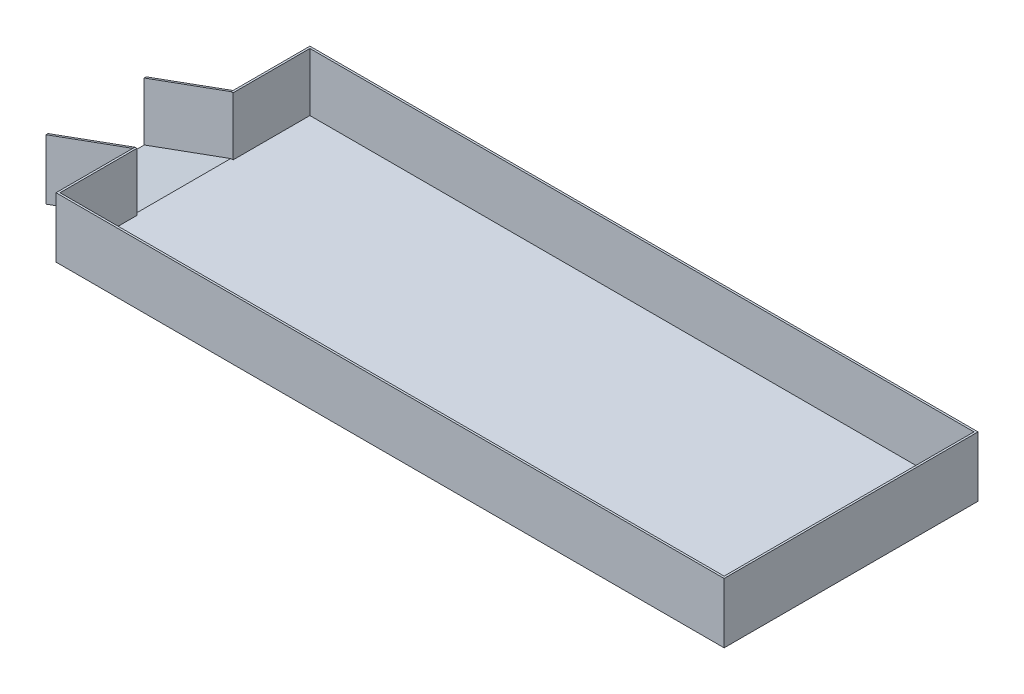
ISO-10303-21;
HEADER;
FILE_DESCRIPTION(('STEP AP214'),'2;1');
FILE_NAME('part.step','',(''),(''),'','','');
FILE_SCHEMA(('AUTOMOTIVE_DESIGN { 1 0 10303 214 1 1 1 1 }'));
ENDSEC;
DATA;
#1=APPLICATION_CONTEXT('core data for automotive mechanical design processes');
#2=APPLICATION_PROTOCOL_DEFINITION('international standard','automotive_design',2000,#1);
#3=PRODUCT_CONTEXT('',#1,'mechanical');
#4=PRODUCT('Part','Part','',(#3));
#5=PRODUCT_RELATED_PRODUCT_CATEGORY('part','',(#4));
#6=PRODUCT_DEFINITION_FORMATION('','',#4);
#7=PRODUCT_DEFINITION_CONTEXT('part definition',#1,'design');
#8=PRODUCT_DEFINITION('design','',#6,#7);
#9=PRODUCT_DEFINITION_SHAPE('','',#8);
#10=(LENGTH_UNIT() NAMED_UNIT(*) SI_UNIT(.MILLI.,.METRE.));
#11=(NAMED_UNIT(*) PLANE_ANGLE_UNIT() SI_UNIT($,.RADIAN.));
#12=(NAMED_UNIT(*) SI_UNIT($,.STERADIAN.) SOLID_ANGLE_UNIT());
#13=UNCERTAINTY_MEASURE_WITH_UNIT(LENGTH_MEASURE(1.E-05),#10,'distance_accuracy_value','');
#14=(GEOMETRIC_REPRESENTATION_CONTEXT(3) GLOBAL_UNCERTAINTY_ASSIGNED_CONTEXT((#13)) GLOBAL_UNIT_ASSIGNED_CONTEXT((#10,
#11,#12)) REPRESENTATION_CONTEXT('',''));
#15=CARTESIAN_POINT('',(0.,0.,0.));
#16=DIRECTION('',(0.,0.,1.));
#17=DIRECTION('',(1.,0.,0.));
#18=AXIS2_PLACEMENT_3D('',#15,#16,#17);
#19=CARTESIAN_POINT('',(0.,90.,0.));
#20=DIRECTION('',(0.,-1.,0.));
#21=DIRECTION('',(0.,0.,-1.));
#22=AXIS2_PLACEMENT_3D('',#19,#20,#21);
#23=PLANE('',#22);
#24=DIRECTION('',(-1.,0.,0.));
#25=VECTOR('',#24,1.);
#26=CARTESIAN_POINT('',(0.,90.,-72.));
#27=LINE('',#26,#25);
#28=CARTESIAN_POINT('',(-497.,90.,-72.));
#29=VERTEX_POINT('',#28);
#30=CARTESIAN_POINT('',(-500.,90.,-72.));
#31=VERTEX_POINT('',#30);
#32=EDGE_CURVE('E204',#29,#31,#27,.T.);
#33=ORIENTED_EDGE('',*,*,#32,.F.);
#34=DIRECTION('',(0.,0.,1.));
#35=VECTOR('',#34,1.);
#36=CARTESIAN_POINT('',(-497.,90.,0.));
#37=LINE('',#36,#35);
#38=CARTESIAN_POINT('',(-497.,90.,-187.));
#39=VERTEX_POINT('',#38);
#40=EDGE_CURVE('E206',#39,#29,#37,.T.);
#41=ORIENTED_EDGE('',*,*,#40,.F.);
#42=DIRECTION('',(-1.,0.,0.));
#43=VECTOR('',#42,1.);
#44=CARTESIAN_POINT('',(0.,90.,-187.));
#45=LINE('',#44,#43);
#46=CARTESIAN_POINT('',(497.,90.,-187.));
#47=VERTEX_POINT('',#46);
#48=EDGE_CURVE('E172',#47,#39,#45,.T.);
#49=ORIENTED_EDGE('',*,*,#48,.F.);
#50=DIRECTION('',(0.,0.,-1.));
#51=VECTOR('',#50,1.);
#52=CARTESIAN_POINT('',(497.,90.,0.));
#53=LINE('',#52,#51);
#54=CARTESIAN_POINT('',(497.,90.,187.));
#55=VERTEX_POINT('',#54);
#56=EDGE_CURVE('E168',#55,#47,#53,.T.);
#57=ORIENTED_EDGE('',*,*,#56,.F.);
#58=DIRECTION('',(1.,0.,0.));
#59=VECTOR('',#58,1.);
#60=CARTESIAN_POINT('',(0.,90.,187.));
#61=LINE('',#60,#59);
#62=CARTESIAN_POINT('',(-497.,90.,187.));
#63=VERTEX_POINT('',#62);
#64=EDGE_CURVE('E178',#63,#55,#61,.T.);
#65=ORIENTED_EDGE('',*,*,#64,.F.);
#66=DIRECTION('',(0.,0.,1.));
#67=VECTOR('',#66,1.);
#68=CARTESIAN_POINT('',(-497.,90.,0.));
#69=LINE('',#68,#67);
#70=CARTESIAN_POINT('',(-497.,90.,72.));
#71=VERTEX_POINT('',#70);
#72=EDGE_CURVE('E161',#71,#63,#69,.T.);
#73=ORIENTED_EDGE('',*,*,#72,.F.);
#74=DIRECTION('',(-1.,0.,0.));
#75=VECTOR('',#74,1.);
#76=CARTESIAN_POINT('',(0.,90.,72.));
#77=LINE('',#76,#75);
#78=CARTESIAN_POINT('',(-500.,90.,72.));
#79=VERTEX_POINT('',#78);
#80=EDGE_CURVE('E225',#71,#79,#77,.T.);
#81=ORIENTED_EDGE('',*,*,#80,.T.);
#82=DIRECTION('',(0.,0.,-1.));
#83=VECTOR('',#82,1.);
#84=CARTESIAN_POINT('',(-500.,90.,75.));
#85=LINE('',#84,#83);
#86=CARTESIAN_POINT('',(-500.,90.,75.));
#87=VERTEX_POINT('',#86);
#88=EDGE_CURVE('E253',#87,#79,#85,.T.);
#89=ORIENTED_EDGE('',*,*,#88,.F.);
#90=DIRECTION('',(0.,0.,1.));
#91=VECTOR('',#90,1.);
#92=CARTESIAN_POINT('',(-500.,90.,190.));
#93=LINE('',#92,#91);
#94=CARTESIAN_POINT('',(-500.,90.,190.));
#95=VERTEX_POINT('',#94);
#96=EDGE_CURVE('E263',#87,#95,#93,.T.);
#97=ORIENTED_EDGE('',*,*,#96,.T.);
#98=DIRECTION('',(1.,0.,0.));
#99=VECTOR('',#98,1.);
#100=CARTESIAN_POINT('',(-500.,90.,190.));
#101=LINE('',#100,#99);
#102=CARTESIAN_POINT('',(500.,90.,190.));
#103=VERTEX_POINT('',#102);
#104=EDGE_CURVE('E270',#95,#103,#101,.T.);
#105=ORIENTED_EDGE('',*,*,#104,.T.);
#106=DIRECTION('',(0.,0.,-1.));
#107=VECTOR('',#106,1.);
#108=CARTESIAN_POINT('',(500.,90.,190.));
#109=LINE('',#108,#107);
#110=CARTESIAN_POINT('',(500.,90.,-190.));
#111=VERTEX_POINT('',#110);
#112=EDGE_CURVE('E260',#103,#111,#109,.T.);
#113=ORIENTED_EDGE('',*,*,#112,.T.);
#114=DIRECTION('',(-1.,0.,0.));
#115=VECTOR('',#114,1.);
#116=CARTESIAN_POINT('',(-500.,90.,-190.));
#117=LINE('',#116,#115);
#118=CARTESIAN_POINT('',(-500.,90.,-190.));
#119=VERTEX_POINT('',#118);
#120=EDGE_CURVE('E257',#111,#119,#117,.T.);
#121=ORIENTED_EDGE('',*,*,#120,.T.);
#122=CARTESIAN_POINT('',(-500.,90.,-75.));
#123=VERTEX_POINT('',#122);
#124=EDGE_CURVE('E262',#119,#123,#93,.T.);
#125=ORIENTED_EDGE('',*,*,#124,.T.);
#126=EDGE_CURVE('E39',#31,#123,#85,.T.);
#127=ORIENTED_EDGE('',*,*,#126,.F.);
#128=EDGE_LOOP('',(#33,#41,#49,#57,#65,#73,#81,#89,#97,#105,#113,#121,#125,#127));
#129=FACE_BOUND('',#128,.T.);
#130=ADVANCED_FACE('F16',(#129),#23,.F.);
#131=CARTESIAN_POINT('',(-500.,90.,75.));
#132=DIRECTION('',(0.34202014332567,-0.939692620785908,0.));
#133=DIRECTION('',(0.939692620785908,0.34202014332567,0.));
#134=AXIS2_PLACEMENT_3D('',#131,#132,#133);
#135=PLANE('',#134);
#136=DIRECTION('',(-0.939692620785908,-0.34202014332567,0.));
#137=VECTOR('',#136,1.);
#138=CARTESIAN_POINT('',(-500.,90.,-72.));
#139=LINE('',#138,#137);
#140=CARTESIAN_POINT('',(-630.,42.6838695453934,-72.));
#141=VERTEX_POINT('',#140);
#142=EDGE_CURVE('E191',#31,#141,#139,.T.);
#143=ORIENTED_EDGE('',*,*,#142,.F.);
#144=ORIENTED_EDGE('',*,*,#126,.T.);
#145=DIRECTION('',(-0.939692620785908,-0.34202014332567,0.));
#146=VECTOR('',#145,1.);
#147=CARTESIAN_POINT('',(-500.,90.,-75.));
#148=LINE('',#147,#146);
#149=CARTESIAN_POINT('',(-630.,42.6838695453934,-75.));
#150=VERTEX_POINT('',#149);
#151=EDGE_CURVE('E245',#123,#150,#148,.T.);
#152=ORIENTED_EDGE('',*,*,#151,.T.);
#153=DIRECTION('',(0.,0.,-1.));
#154=VECTOR('',#153,1.);
#155=CARTESIAN_POINT('',(-630.,42.6838695453934,75.));
#156=LINE('',#155,#154);
#157=EDGE_CURVE('E250',#141,#150,#156,.T.);
#158=ORIENTED_EDGE('',*,*,#157,.F.);
#159=EDGE_LOOP('',(#143,#144,#152,#158));
#160=FACE_BOUND('',#159,.T.);
#161=ADVANCED_FACE('F332',(#160),#135,.F.);
#162=CARTESIAN_POINT('',(-630.,42.6838695453934,75.));
#163=DIRECTION('',(1.,0.,0.));
#164=DIRECTION('',(0.,0.,-1.));
#165=AXIS2_PLACEMENT_3D('',#162,#163,#164);
#166=PLANE('',#165);
#167=DIRECTION('',(0.,-1.,0.));
#168=VECTOR('',#167,1.);
#169=CARTESIAN_POINT('',(-630.,42.6838695453934,-72.));
#170=LINE('',#169,#168);
#171=CARTESIAN_POINT('',(-630.,-44.1235971371788,-72.));
#172=VERTEX_POINT('',#171);
#173=EDGE_CURVE('E199',#141,#172,#170,.T.);
#174=ORIENTED_EDGE('',*,*,#173,.F.);
#175=ORIENTED_EDGE('',*,*,#157,.T.);
#176=DIRECTION('',(0.,-1.,0.));
#177=VECTOR('',#176,1.);
#178=CARTESIAN_POINT('',(-630.,42.6838695453934,-75.));
#179=LINE('',#178,#177);
#180=CARTESIAN_POINT('',(-630.,-47.3161304546065,-75.));
#181=VERTEX_POINT('',#180);
#182=EDGE_CURVE('E230',#150,#181,#179,.T.);
#183=ORIENTED_EDGE('',*,*,#182,.T.);
#184=DIRECTION('',(0.,0.,-1.));
#185=VECTOR('',#184,1.);
#186=CARTESIAN_POINT('',(-630.,-47.3161304546065,75.));
#187=LINE('',#186,#185);
#188=CARTESIAN_POINT('',(-630.,-47.3161304546065,75.));
#189=VERTEX_POINT('',#188);
#190=EDGE_CURVE('E236',#189,#181,#187,.T.);
#191=ORIENTED_EDGE('',*,*,#190,.F.);
#192=DIRECTION('',(0.,-1.,0.));
#193=VECTOR('',#192,1.);
#194=CARTESIAN_POINT('',(-630.,42.6838695453934,75.));
#195=LINE('',#194,#193);
#196=CARTESIAN_POINT('',(-630.,42.6838695453934,75.));
#197=VERTEX_POINT('',#196);
#198=EDGE_CURVE('E234',#197,#189,#195,.T.);
#199=ORIENTED_EDGE('',*,*,#198,.F.);
#200=CARTESIAN_POINT('',(-630.,42.6838695453934,72.));
#201=VERTEX_POINT('',#200);
#202=EDGE_CURVE('E248',#197,#201,#156,.T.);
#203=ORIENTED_EDGE('',*,*,#202,.T.);
#204=DIRECTION('',(0.,-1.,0.));
#205=VECTOR('',#204,1.);
#206=CARTESIAN_POINT('',(-630.,42.6838695453934,72.));
#207=LINE('',#206,#205);
#208=CARTESIAN_POINT('',(-630.,-44.1235971371788,72.));
#209=VERTEX_POINT('',#208);
#210=EDGE_CURVE('E214',#201,#209,#207,.T.);
#211=ORIENTED_EDGE('',*,*,#210,.T.);
#212=DIRECTION('',(0.,0.,-1.));
#213=VECTOR('',#212,1.);
#214=CARTESIAN_POINT('',(-630.,-44.1235971371788,75.));
#215=LINE('',#214,#213);
#216=EDGE_CURVE('E194',#209,#172,#215,.T.);
#217=ORIENTED_EDGE('',*,*,#216,.T.);
#218=EDGE_LOOP('',(#174,#175,#183,#191,#199,#203,#211,#217));
#219=FACE_BOUND('',#218,.T.);
#220=ADVANCED_FACE('F328',(#219),#166,.F.);
#221=CARTESIAN_POINT('',(-500.,90.,190.));
#222=DIRECTION('',(1.,0.,0.));
#223=DIRECTION('',(0.,0.,-1.));
#224=AXIS2_PLACEMENT_3D('',#221,#222,#223);
#225=PLANE('',#224);
#226=DIRECTION('',(0.,1.,0.));
#227=VECTOR('',#226,1.);
#228=CARTESIAN_POINT('',(-500.,0.,75.));
#229=LINE('',#228,#227);
#230=CARTESIAN_POINT('',(-500.,0.,75.));
#231=VERTEX_POINT('',#230);
#232=EDGE_CURVE('E228',#231,#87,#229,.T.);
#233=ORIENTED_EDGE('',*,*,#232,.F.);
#234=DIRECTION('',(0.,0.,1.));
#235=VECTOR('',#234,1.);
#236=CARTESIAN_POINT('',(-500.,0.,190.));
#237=LINE('',#236,#235);
#238=CARTESIAN_POINT('',(-500.,0.,190.));
#239=VERTEX_POINT('',#238);
#240=EDGE_CURVE('E273',#231,#239,#237,.T.);
#241=ORIENTED_EDGE('',*,*,#240,.T.);
#242=DIRECTION('',(0.,-1.,0.));
#243=VECTOR('',#242,1.);
#244=CARTESIAN_POINT('',(-500.,90.,190.));
#245=LINE('',#244,#243);
#246=EDGE_CURVE('E281',#95,#239,#245,.T.);
#247=ORIENTED_EDGE('',*,*,#246,.F.);
#248=ORIENTED_EDGE('',*,*,#96,.F.);
#249=EDGE_LOOP('',(#233,#241,#247,#248));
#250=FACE_BOUND('',#249,.T.);
#251=ADVANCED_FACE('F317',(#250),#225,.F.);
#252=CARTESIAN_POINT('',(500.,90.,190.));
#253=DIRECTION('',(-1.,0.,0.));
#254=DIRECTION('',(0.,0.,1.));
#255=AXIS2_PLACEMENT_3D('',#252,#253,#254);
#256=PLANE('',#255);
#257=DIRECTION('',(0.,0.,-1.));
#258=VECTOR('',#257,1.);
#259=CARTESIAN_POINT('',(500.,0.,190.));
#260=LINE('',#259,#258);
#261=CARTESIAN_POINT('',(500.,0.,190.));
#262=VERTEX_POINT('',#261);
#263=CARTESIAN_POINT('',(500.,0.,-190.));
#264=VERTEX_POINT('',#263);
#265=EDGE_CURVE('E258',#262,#264,#260,.T.);
#266=ORIENTED_EDGE('',*,*,#265,.T.);
#267=DIRECTION('',(0.,-1.,0.));
#268=VECTOR('',#267,1.);
#269=CARTESIAN_POINT('',(500.,90.,-190.));
#270=LINE('',#269,#268);
#271=EDGE_CURVE('E11',#111,#264,#270,.T.);
#272=ORIENTED_EDGE('',*,*,#271,.F.);
#273=ORIENTED_EDGE('',*,*,#112,.F.);
#274=DIRECTION('',(0.,-1.,0.));
#275=VECTOR('',#274,1.);
#276=CARTESIAN_POINT('',(500.,90.,190.));
#277=LINE('',#276,#275);
#278=EDGE_CURVE('E267',#103,#262,#277,.T.);
#279=ORIENTED_EDGE('',*,*,#278,.T.);
#280=EDGE_LOOP('',(#266,#272,#273,#279));
#281=FACE_BOUND('',#280,.T.);
#282=ADVANCED_FACE('F18',(#281),#256,.F.);
#283=CARTESIAN_POINT('',(-500.,90.,-190.));
#284=DIRECTION('',(0.,0.,1.));
#285=DIRECTION('',(1.,0.,0.));
#286=AXIS2_PLACEMENT_3D('',#283,#284,#285);
#287=PLANE('',#286);
#288=DIRECTION('',(-1.,0.,0.));
#289=VECTOR('',#288,1.);
#290=CARTESIAN_POINT('',(-500.,0.,-190.));
#291=LINE('',#290,#289);
#292=CARTESIAN_POINT('',(-500.,0.,-190.));
#293=VERTEX_POINT('',#292);
#294=EDGE_CURVE('E275',#264,#293,#291,.T.);
#295=ORIENTED_EDGE('',*,*,#294,.T.);
#296=DIRECTION('',(0.,-1.,0.));
#297=VECTOR('',#296,1.);
#298=CARTESIAN_POINT('',(-500.,90.,-190.));
#299=LINE('',#298,#297);
#300=EDGE_CURVE('E24',#119,#293,#299,.T.);
#301=ORIENTED_EDGE('',*,*,#300,.F.);
#302=ORIENTED_EDGE('',*,*,#120,.F.);
#303=ORIENTED_EDGE('',*,*,#271,.T.);
#304=EDGE_LOOP('',(#295,#301,#302,#303));
#305=FACE_BOUND('',#304,.T.);
#306=ADVANCED_FACE('F309',(#305),#287,.F.);
#307=CARTESIAN_POINT('',(-500.,0.,-75.));
#308=VERTEX_POINT('',#307);
#309=EDGE_CURVE('E274',#293,#308,#237,.T.);
#310=ORIENTED_EDGE('',*,*,#309,.T.);
#311=DIRECTION('',(0.,1.,0.));
#312=VECTOR('',#311,1.);
#313=CARTESIAN_POINT('',(-500.,0.,-75.));
#314=LINE('',#313,#312);
#315=EDGE_CURVE('E239',#308,#123,#314,.T.);
#316=ORIENTED_EDGE('',*,*,#315,.T.);
#317=ORIENTED_EDGE('',*,*,#124,.F.);
#318=ORIENTED_EDGE('',*,*,#300,.T.);
#319=EDGE_LOOP('',(#310,#316,#317,#318));
#320=FACE_BOUND('',#319,.T.);
#321=ADVANCED_FACE('F288',(#320),#225,.F.);
#322=CARTESIAN_POINT('',(-500.,90.,190.));
#323=DIRECTION('',(0.,0.,-1.));
#324=DIRECTION('',(-1.,0.,0.));
#325=AXIS2_PLACEMENT_3D('',#322,#323,#324);
#326=PLANE('',#325);
#327=DIRECTION('',(1.,0.,0.));
#328=VECTOR('',#327,1.);
#329=CARTESIAN_POINT('',(-500.,0.,190.));
#330=LINE('',#329,#328);
#331=EDGE_CURVE('E261',#239,#262,#330,.T.);
#332=ORIENTED_EDGE('',*,*,#331,.T.);
#333=ORIENTED_EDGE('',*,*,#278,.F.);
#334=ORIENTED_EDGE('',*,*,#104,.F.);
#335=ORIENTED_EDGE('',*,*,#246,.T.);
#336=EDGE_LOOP('',(#332,#333,#334,#335));
#337=FACE_BOUND('',#336,.T.);
#338=ADVANCED_FACE('F314',(#337),#326,.F.);
#339=CARTESIAN_POINT('',(0.,0.,0.));
#340=DIRECTION('',(0.,-1.,0.));
#341=DIRECTION('',(0.,0.,-1.));
#342=AXIS2_PLACEMENT_3D('',#339,#340,#341);
#343=PLANE('',#342);
#344=ORIENTED_EDGE('',*,*,#265,.F.);
#345=ORIENTED_EDGE('',*,*,#331,.F.);
#346=ORIENTED_EDGE('',*,*,#240,.F.);
#347=DIRECTION('',(0.,0.,-1.));
#348=VECTOR('',#347,1.);
#349=CARTESIAN_POINT('',(-500.,0.,75.));
#350=LINE('',#349,#348);
#351=EDGE_CURVE('E255',#231,#308,#350,.T.);
#352=ORIENTED_EDGE('',*,*,#351,.T.);
#353=ORIENTED_EDGE('',*,*,#309,.F.);
#354=ORIENTED_EDGE('',*,*,#294,.F.);
#355=EDGE_LOOP('',(#344,#345,#346,#352,#353,#354));
#356=FACE_BOUND('',#355,.T.);
#357=ADVANCED_FACE('F293',(#356),#343,.T.);
#358=CARTESIAN_POINT('',(-630.,-47.3161304546065,75.));
#359=DIRECTION('',(-0.34202014332567,0.939692620785908,0.));
#360=DIRECTION('',(-0.939692620785908,-0.34202014332567,0.));
#361=AXIS2_PLACEMENT_3D('',#358,#359,#360);
#362=PLANE('',#361);
#363=DIRECTION('',(0.939692620785908,0.34202014332567,0.));
#364=VECTOR('',#363,1.);
#365=CARTESIAN_POINT('',(-630.,-47.3161304546065,-75.));
#366=LINE('',#365,#364);
#367=EDGE_CURVE('E223',#181,#308,#366,.T.);
#368=ORIENTED_EDGE('',*,*,#367,.T.);
#369=ORIENTED_EDGE('',*,*,#351,.F.);
#370=DIRECTION('',(0.939692620785908,0.34202014332567,0.));
#371=VECTOR('',#370,1.);
#372=CARTESIAN_POINT('',(-630.,-47.3161304546065,75.));
#373=LINE('',#372,#371);
#374=EDGE_CURVE('E226',#189,#231,#373,.T.);
#375=ORIENTED_EDGE('',*,*,#374,.F.);
#376=ORIENTED_EDGE('',*,*,#190,.T.);
#377=EDGE_LOOP('',(#368,#369,#375,#376));
#378=FACE_BOUND('',#377,.T.);
#379=ADVANCED_FACE('F298',(#378),#362,.F.);
#380=ORIENTED_EDGE('',*,*,#88,.T.);
#381=DIRECTION('',(-0.939692620785908,-0.34202014332567,0.));
#382=VECTOR('',#381,1.);
#383=CARTESIAN_POINT('',(-500.,90.,72.));
#384=LINE('',#383,#382);
#385=EDGE_CURVE('E217',#79,#201,#384,.T.);
#386=ORIENTED_EDGE('',*,*,#385,.T.);
#387=ORIENTED_EDGE('',*,*,#202,.F.);
#388=DIRECTION('',(-0.939692620785908,-0.34202014332567,0.));
#389=VECTOR('',#388,1.);
#390=CARTESIAN_POINT('',(-500.,90.,75.));
#391=LINE('',#390,#389);
#392=EDGE_CURVE('E233',#87,#197,#391,.T.);
#393=ORIENTED_EDGE('',*,*,#392,.F.);
#394=EDGE_LOOP('',(#380,#386,#387,#393));
#395=FACE_BOUND('',#394,.T.);
#396=ADVANCED_FACE('F324',(#395),#135,.F.);
#397=CARTESIAN_POINT('',(0.,0.,75.));
#398=DIRECTION('',(0.,0.,1.));
#399=DIRECTION('',(1.,0.,0.));
#400=AXIS2_PLACEMENT_3D('',#397,#398,#399);
#401=PLANE('',#400);
#402=ORIENTED_EDGE('',*,*,#374,.T.);
#403=ORIENTED_EDGE('',*,*,#232,.T.);
#404=ORIENTED_EDGE('',*,*,#392,.T.);
#405=ORIENTED_EDGE('',*,*,#198,.T.);
#406=EDGE_LOOP('',(#402,#403,#404,#405));
#407=FACE_BOUND('',#406,.T.);
#408=ADVANCED_FACE('F325',(#407),#401,.T.);
#409=CARTESIAN_POINT('',(0.,0.,-75.));
#410=DIRECTION('',(0.,0.,1.));
#411=DIRECTION('',(1.,0.,0.));
#412=AXIS2_PLACEMENT_3D('',#409,#410,#411);
#413=PLANE('',#412);
#414=ORIENTED_EDGE('',*,*,#367,.F.);
#415=ORIENTED_EDGE('',*,*,#182,.F.);
#416=ORIENTED_EDGE('',*,*,#151,.F.);
#417=ORIENTED_EDGE('',*,*,#315,.F.);
#418=EDGE_LOOP('',(#414,#415,#416,#417));
#419=FACE_BOUND('',#418,.T.);
#420=ADVANCED_FACE('F302',(#419),#413,.F.);
#421=CARTESIAN_POINT('',(-497.,90.,190.));
#422=DIRECTION('',(1.,0.,0.));
#423=DIRECTION('',(0.,0.,-1.));
#424=AXIS2_PLACEMENT_3D('',#421,#422,#423);
#425=PLANE('',#424);
#426=DIRECTION('',(0.,1.,0.));
#427=VECTOR('',#426,1.);
#428=CARTESIAN_POINT('',(-497.,0.,72.));
#429=LINE('',#428,#427);
#430=CARTESIAN_POINT('',(-497.,3.,72.));
#431=VERTEX_POINT('',#430);
#432=EDGE_CURVE('E200',#431,#71,#429,.T.);
#433=ORIENTED_EDGE('',*,*,#432,.T.);
#434=ORIENTED_EDGE('',*,*,#72,.T.);
#435=DIRECTION('',(0.,-1.,0.));
#436=VECTOR('',#435,1.);
#437=CARTESIAN_POINT('',(-497.,90.,187.));
#438=LINE('',#437,#436);
#439=CARTESIAN_POINT('',(-497.,3.,187.));
#440=VERTEX_POINT('',#439);
#441=EDGE_CURVE('E158',#63,#440,#438,.T.);
#442=ORIENTED_EDGE('',*,*,#441,.T.);
#443=DIRECTION('',(0.,0.,1.));
#444=VECTOR('',#443,1.);
#445=CARTESIAN_POINT('',(-497.,3.,0.));
#446=LINE('',#445,#444);
#447=EDGE_CURVE('E142',#431,#440,#446,.T.);
#448=ORIENTED_EDGE('',*,*,#447,.F.);
#449=EDGE_LOOP('',(#433,#434,#442,#448));
#450=FACE_BOUND('',#449,.T.);
#451=ADVANCED_FACE('F157',(#450),#425,.T.);
#452=CARTESIAN_POINT('',(497.,90.,190.));
#453=DIRECTION('',(-1.,0.,0.));
#454=DIRECTION('',(0.,0.,1.));
#455=AXIS2_PLACEMENT_3D('',#452,#453,#454);
#456=PLANE('',#455);
#457=DIRECTION('',(0.,0.,-1.));
#458=VECTOR('',#457,1.);
#459=CARTESIAN_POINT('',(497.,3.,0.));
#460=LINE('',#459,#458);
#461=CARTESIAN_POINT('',(497.,3.,187.));
#462=VERTEX_POINT('',#461);
#463=CARTESIAN_POINT('',(497.,3.,-187.));
#464=VERTEX_POINT('',#463);
#465=EDGE_CURVE('E177',#462,#464,#460,.T.);
#466=ORIENTED_EDGE('',*,*,#465,.F.);
#467=DIRECTION('',(0.,-1.,0.));
#468=VECTOR('',#467,1.);
#469=CARTESIAN_POINT('',(497.,90.,187.));
#470=LINE('',#469,#468);
#471=EDGE_CURVE('E164',#55,#462,#470,.T.);
#472=ORIENTED_EDGE('',*,*,#471,.F.);
#473=ORIENTED_EDGE('',*,*,#56,.T.);
#474=DIRECTION('',(0.,-1.,0.));
#475=VECTOR('',#474,1.);
#476=CARTESIAN_POINT('',(497.,90.,-187.));
#477=LINE('',#476,#475);
#478=EDGE_CURVE('E181',#47,#464,#477,.T.);
#479=ORIENTED_EDGE('',*,*,#478,.T.);
#480=EDGE_LOOP('',(#466,#472,#473,#479));
#481=FACE_BOUND('',#480,.T.);
#482=ADVANCED_FACE('F417',(#481),#456,.T.);
#483=CARTESIAN_POINT('',(-500.,90.,-187.));
#484=DIRECTION('',(0.,0.,1.));
#485=DIRECTION('',(1.,0.,0.));
#486=AXIS2_PLACEMENT_3D('',#483,#484,#485);
#487=PLANE('',#486);
#488=DIRECTION('',(-1.,0.,0.));
#489=VECTOR('',#488,1.);
#490=CARTESIAN_POINT('',(0.,3.,-187.));
#491=LINE('',#490,#489);
#492=CARTESIAN_POINT('',(-497.,3.,-187.));
#493=VERTEX_POINT('',#492);
#494=EDGE_CURVE('E154',#464,#493,#491,.T.);
#495=ORIENTED_EDGE('',*,*,#494,.F.);
#496=ORIENTED_EDGE('',*,*,#478,.F.);
#497=ORIENTED_EDGE('',*,*,#48,.T.);
#498=DIRECTION('',(0.,-1.,0.));
#499=VECTOR('',#498,1.);
#500=CARTESIAN_POINT('',(-497.,90.,-187.));
#501=LINE('',#500,#499);
#502=EDGE_CURVE('E163',#39,#493,#501,.T.);
#503=ORIENTED_EDGE('',*,*,#502,.T.);
#504=EDGE_LOOP('',(#495,#496,#497,#503));
#505=FACE_BOUND('',#504,.T.);
#506=ADVANCED_FACE('F422',(#505),#487,.T.);
#507=DIRECTION('',(0.,0.,1.));
#508=VECTOR('',#507,1.);
#509=CARTESIAN_POINT('',(-497.,3.,0.));
#510=LINE('',#509,#508);
#511=CARTESIAN_POINT('',(-497.,3.,-72.));
#512=VERTEX_POINT('',#511);
#513=EDGE_CURVE('E152',#493,#512,#510,.T.);
#514=ORIENTED_EDGE('',*,*,#513,.F.);
#515=ORIENTED_EDGE('',*,*,#502,.F.);
#516=ORIENTED_EDGE('',*,*,#40,.T.);
#517=DIRECTION('',(0.,1.,0.));
#518=VECTOR('',#517,1.);
#519=CARTESIAN_POINT('',(-497.,0.,-72.));
#520=LINE('',#519,#518);
#521=EDGE_CURVE('E188',#512,#29,#520,.T.);
#522=ORIENTED_EDGE('',*,*,#521,.F.);
#523=EDGE_LOOP('',(#514,#515,#516,#522));
#524=FACE_BOUND('',#523,.T.);
#525=ADVANCED_FACE('F420',(#524),#425,.T.);
#526=CARTESIAN_POINT('',(-500.,90.,187.));
#527=DIRECTION('',(0.,0.,-1.));
#528=DIRECTION('',(-1.,0.,0.));
#529=AXIS2_PLACEMENT_3D('',#526,#527,#528);
#530=PLANE('',#529);
#531=DIRECTION('',(1.,0.,0.));
#532=VECTOR('',#531,1.);
#533=CARTESIAN_POINT('',(0.,3.,187.));
#534=LINE('',#533,#532);
#535=EDGE_CURVE('E150',#440,#462,#534,.T.);
#536=ORIENTED_EDGE('',*,*,#535,.F.);
#537=ORIENTED_EDGE('',*,*,#441,.F.);
#538=ORIENTED_EDGE('',*,*,#64,.T.);
#539=ORIENTED_EDGE('',*,*,#471,.T.);
#540=EDGE_LOOP('',(#536,#537,#538,#539));
#541=FACE_BOUND('',#540,.T.);
#542=ADVANCED_FACE('F170',(#541),#530,.T.);
#543=CARTESIAN_POINT('',(0.,3.,0.));
#544=DIRECTION('',(0.,-1.,0.));
#545=DIRECTION('',(0.,0.,-1.));
#546=AXIS2_PLACEMENT_3D('',#543,#544,#545);
#547=PLANE('',#546);
#548=ORIENTED_EDGE('',*,*,#465,.T.);
#549=ORIENTED_EDGE('',*,*,#494,.T.);
#550=ORIENTED_EDGE('',*,*,#513,.T.);
#551=DIRECTION('',(1.,0.,0.));
#552=VECTOR('',#551,1.);
#553=CARTESIAN_POINT('',(0.,3.,-72.));
#554=LINE('',#553,#552);
#555=CARTESIAN_POINT('',(-500.528980942125,3.,-72.));
#556=VERTEX_POINT('',#555);
#557=EDGE_CURVE('E184',#556,#512,#554,.T.);
#558=ORIENTED_EDGE('',*,*,#557,.F.);
#559=DIRECTION('',(0.,0.,-1.));
#560=VECTOR('',#559,1.);
#561=CARTESIAN_POINT('',(-500.528980942125,3.,0.));
#562=LINE('',#561,#560);
#563=CARTESIAN_POINT('',(-500.528980942125,3.,72.));
#564=VERTEX_POINT('',#563);
#565=EDGE_CURVE('E185',#564,#556,#562,.T.);
#566=ORIENTED_EDGE('',*,*,#565,.F.);
#567=DIRECTION('',(1.,0.,0.));
#568=VECTOR('',#567,1.);
#569=CARTESIAN_POINT('',(0.,3.,72.));
#570=LINE('',#569,#568);
#571=EDGE_CURVE('E147',#564,#431,#570,.T.);
#572=ORIENTED_EDGE('',*,*,#571,.T.);
#573=ORIENTED_EDGE('',*,*,#447,.T.);
#574=ORIENTED_EDGE('',*,*,#535,.T.);
#575=EDGE_LOOP('',(#548,#549,#550,#558,#566,#572,#573,#574));
#576=FACE_BOUND('',#575,.T.);
#577=ADVANCED_FACE('F144',(#576),#547,.F.);
#578=CARTESIAN_POINT('',(-631.026060429977,-44.4970525922488,75.));
#579=DIRECTION('',(-0.34202014332567,0.939692620785908,0.));
#580=DIRECTION('',(-0.939692620785908,-0.34202014332567,0.));
#581=AXIS2_PLACEMENT_3D('',#578,#579,#580);
#582=PLANE('',#581);
#583=DIRECTION('',(0.939692620785908,0.34202014332567,0.));
#584=VECTOR('',#583,1.);
#585=CARTESIAN_POINT('',(-631.026060429977,-44.4970525922488,-72.));
#586=LINE('',#585,#584);
#587=EDGE_CURVE('E195',#172,#556,#586,.T.);
#588=ORIENTED_EDGE('',*,*,#587,.F.);
#589=ORIENTED_EDGE('',*,*,#216,.F.);
#590=DIRECTION('',(0.939692620785908,0.34202014332567,0.));
#591=VECTOR('',#590,1.);
#592=CARTESIAN_POINT('',(-631.026060429977,-44.4970525922488,72.));
#593=LINE('',#592,#591);
#594=EDGE_CURVE('E33',#209,#564,#593,.T.);
#595=ORIENTED_EDGE('',*,*,#594,.T.);
#596=ORIENTED_EDGE('',*,*,#565,.T.);
#597=EDGE_LOOP('',(#588,#589,#595,#596));
#598=FACE_BOUND('',#597,.T.);
#599=ADVANCED_FACE('F455',(#598),#582,.T.);
#600=CARTESIAN_POINT('',(0.,0.,72.));
#601=DIRECTION('',(0.,0.,1.));
#602=DIRECTION('',(1.,0.,0.));
#603=AXIS2_PLACEMENT_3D('',#600,#601,#602);
#604=PLANE('',#603);
#605=ORIENTED_EDGE('',*,*,#594,.F.);
#606=ORIENTED_EDGE('',*,*,#210,.F.);
#607=ORIENTED_EDGE('',*,*,#385,.F.);
#608=ORIENTED_EDGE('',*,*,#80,.F.);
#609=ORIENTED_EDGE('',*,*,#432,.F.);
#610=ORIENTED_EDGE('',*,*,#571,.F.);
#611=EDGE_LOOP('',(#605,#606,#607,#608,#609,#610));
#612=FACE_BOUND('',#611,.T.);
#613=ADVANCED_FACE('F457',(#612),#604,.F.);
#614=CARTESIAN_POINT('',(0.,0.,-72.));
#615=DIRECTION('',(0.,0.,1.));
#616=DIRECTION('',(1.,0.,0.));
#617=AXIS2_PLACEMENT_3D('',#614,#615,#616);
#618=PLANE('',#617);
#619=ORIENTED_EDGE('',*,*,#587,.T.);
#620=ORIENTED_EDGE('',*,*,#557,.T.);
#621=ORIENTED_EDGE('',*,*,#521,.T.);
#622=ORIENTED_EDGE('',*,*,#32,.T.);
#623=ORIENTED_EDGE('',*,*,#142,.T.);
#624=ORIENTED_EDGE('',*,*,#173,.T.);
#625=EDGE_LOOP('',(#619,#620,#621,#622,#623,#624));
#626=FACE_BOUND('',#625,.T.);
#627=ADVANCED_FACE('F470',(#626),#618,.T.);
#628=CLOSED_SHELL('',(#130,#161,#220,#251,#282,#306,#321,#338,#357,#379,#396,#408,#420,#451,
#482,#506,#525,#542,#577,#599,#613,#627));
#629=MANIFOLD_SOLID_BREP('B1',#628);
#630=ADVANCED_BREP_SHAPE_REPRESENTATION('',(#18,#629),#14);
#631=SHAPE_DEFINITION_REPRESENTATION(#9,#630);
ENDSEC;
END-ISO-10303-21;
